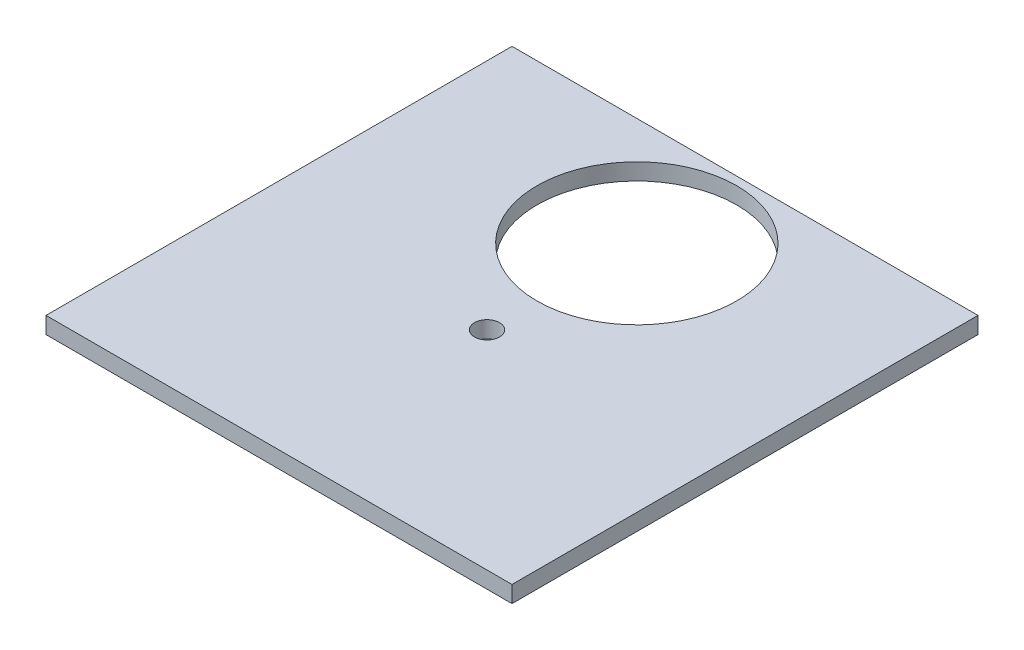
ISO-10303-21;
HEADER;
FILE_DESCRIPTION(('STEP AP214'),'2;1');
FILE_NAME('part.step','',(''),(''),'','','');
FILE_SCHEMA(('AUTOMOTIVE_DESIGN { 1 0 10303 214 1 1 1 1 }'));
ENDSEC;
DATA;
#1=APPLICATION_CONTEXT('core data for automotive mechanical design processes');
#2=APPLICATION_PROTOCOL_DEFINITION('international standard','automotive_design',2000,#1);
#3=PRODUCT_CONTEXT('',#1,'mechanical');
#4=PRODUCT('Part','Part','',(#3));
#5=PRODUCT_RELATED_PRODUCT_CATEGORY('part','',(#4));
#6=PRODUCT_DEFINITION_FORMATION('','',#4);
#7=PRODUCT_DEFINITION_CONTEXT('part definition',#1,'design');
#8=PRODUCT_DEFINITION('design','',#6,#7);
#9=PRODUCT_DEFINITION_SHAPE('','',#8);
#10=(LENGTH_UNIT() NAMED_UNIT(*) SI_UNIT(.MILLI.,.METRE.));
#11=(NAMED_UNIT(*) PLANE_ANGLE_UNIT() SI_UNIT($,.RADIAN.));
#12=(NAMED_UNIT(*) SI_UNIT($,.STERADIAN.) SOLID_ANGLE_UNIT());
#13=UNCERTAINTY_MEASURE_WITH_UNIT(LENGTH_MEASURE(1.E-05),#10,'distance_accuracy_value','');
#14=(GEOMETRIC_REPRESENTATION_CONTEXT(3) GLOBAL_UNCERTAINTY_ASSIGNED_CONTEXT((#13)) GLOBAL_UNIT_ASSIGNED_CONTEXT((#10,
#11,#12)) REPRESENTATION_CONTEXT('',''));
#15=CARTESIAN_POINT('',(0.,0.,0.));
#16=DIRECTION('',(0.,0.,1.));
#17=DIRECTION('',(1.,0.,0.));
#18=AXIS2_PLACEMENT_3D('',#15,#16,#17);
#19=CARTESIAN_POINT('',(45.7068504945369,-2.54,30.903644768989));
#20=DIRECTION('',(1.,0.,0.));
#21=DIRECTION('',(0.,0.,-1.));
#22=AXIS2_PLACEMENT_3D('',#19,#20,#21);
#23=PLANE('',#22);
#24=DIRECTION('',(0.,0.,-1.));
#25=VECTOR('',#24,1.);
#26=CARTESIAN_POINT('',(45.7068504945369,0.,30.903644768989));
#27=LINE('',#26,#25);
#28=CARTESIAN_POINT('',(45.7068504945369,0.,30.903644768989));
#29=VERTEX_POINT('',#28);
#30=CARTESIAN_POINT('',(45.7068504945369,0.,-40.2163552310109));
#31=VERTEX_POINT('',#30);
#32=EDGE_CURVE('E98',#29,#31,#27,.T.);
#33=ORIENTED_EDGE('',*,*,#32,.F.);
#34=DIRECTION('',(0.,1.,0.));
#35=VECTOR('',#34,1.);
#36=CARTESIAN_POINT('',(45.7068504945369,-2.54,30.903644768989));
#37=LINE('',#36,#35);
#38=CARTESIAN_POINT('',(45.7068504945369,-2.54,30.903644768989));
#39=VERTEX_POINT('',#38);
#40=EDGE_CURVE('E11',#39,#29,#37,.T.);
#41=ORIENTED_EDGE('',*,*,#40,.F.);
#42=DIRECTION('',(0.,0.,-1.));
#43=VECTOR('',#42,1.);
#44=CARTESIAN_POINT('',(45.7068504945369,-2.54,30.903644768989));
#45=LINE('',#44,#43);
#46=CARTESIAN_POINT('',(45.7068504945369,-2.54,-40.2163552310109));
#47=VERTEX_POINT('',#46);
#48=EDGE_CURVE('E91',#39,#47,#45,.T.);
#49=ORIENTED_EDGE('',*,*,#48,.T.);
#50=DIRECTION('',(0.,1.,0.));
#51=VECTOR('',#50,1.);
#52=CARTESIAN_POINT('',(45.7068504945369,-2.54,-40.2163552310109));
#53=LINE('',#52,#51);
#54=EDGE_CURVE('E36',#47,#31,#53,.T.);
#55=ORIENTED_EDGE('',*,*,#54,.T.);
#56=EDGE_LOOP('',(#33,#41,#49,#55));
#57=FACE_BOUND('',#56,.T.);
#58=ADVANCED_FACE('F33',(#57),#23,.T.);
#59=CARTESIAN_POINT('',(-25.4131495054631,-2.54,30.903644768989));
#60=DIRECTION('',(0.,0.,1.));
#61=DIRECTION('',(1.,0.,0.));
#62=AXIS2_PLACEMENT_3D('',#59,#60,#61);
#63=PLANE('',#62);
#64=DIRECTION('',(1.,0.,0.));
#65=VECTOR('',#64,1.);
#66=CARTESIAN_POINT('',(-25.4131495054631,0.,30.903644768989));
#67=LINE('',#66,#65);
#68=CARTESIAN_POINT('',(-25.4131495054631,0.,30.903644768989));
#69=VERTEX_POINT('',#68);
#70=EDGE_CURVE('E93',#69,#29,#67,.T.);
#71=ORIENTED_EDGE('',*,*,#70,.F.);
#72=DIRECTION('',(0.,1.,0.));
#73=VECTOR('',#72,1.);
#74=CARTESIAN_POINT('',(-25.4131495054631,-2.54,30.903644768989));
#75=LINE('',#74,#73);
#76=CARTESIAN_POINT('',(-25.4131495054631,-2.54,30.903644768989));
#77=VERTEX_POINT('',#76);
#78=EDGE_CURVE('E42',#77,#69,#75,.T.);
#79=ORIENTED_EDGE('',*,*,#78,.F.);
#80=DIRECTION('',(1.,0.,0.));
#81=VECTOR('',#80,1.);
#82=CARTESIAN_POINT('',(-25.4131495054631,-2.54,30.903644768989));
#83=LINE('',#82,#81);
#84=EDGE_CURVE('E88',#77,#39,#83,.T.);
#85=ORIENTED_EDGE('',*,*,#84,.T.);
#86=ORIENTED_EDGE('',*,*,#40,.T.);
#87=EDGE_LOOP('',(#71,#79,#85,#86));
#88=FACE_BOUND('',#87,.T.);
#89=ADVANCED_FACE('F109',(#88),#63,.T.);
#90=CARTESIAN_POINT('',(-25.4131495054631,-2.54,30.903644768989));
#91=DIRECTION('',(-1.,0.,0.));
#92=DIRECTION('',(0.,0.,1.));
#93=AXIS2_PLACEMENT_3D('',#90,#91,#92);
#94=PLANE('',#93);
#95=DIRECTION('',(0.,0.,1.));
#96=VECTOR('',#95,1.);
#97=CARTESIAN_POINT('',(-25.4131495054631,0.,30.903644768989));
#98=LINE('',#97,#96);
#99=CARTESIAN_POINT('',(-25.4131495054631,0.,-40.2163552310109));
#100=VERTEX_POINT('',#99);
#101=EDGE_CURVE('E83',#100,#69,#98,.T.);
#102=ORIENTED_EDGE('',*,*,#101,.F.);
#103=DIRECTION('',(0.,1.,0.));
#104=VECTOR('',#103,1.);
#105=CARTESIAN_POINT('',(-25.4131495054631,-2.54,-40.2163552310109));
#106=LINE('',#105,#104);
#107=CARTESIAN_POINT('',(-25.4131495054631,-2.54,-40.2163552310109));
#108=VERTEX_POINT('',#107);
#109=EDGE_CURVE('E78',#108,#100,#106,.T.);
#110=ORIENTED_EDGE('',*,*,#109,.F.);
#111=DIRECTION('',(0.,0.,1.));
#112=VECTOR('',#111,1.);
#113=CARTESIAN_POINT('',(-25.4131495054631,-2.54,30.903644768989));
#114=LINE('',#113,#112);
#115=EDGE_CURVE('E81',#108,#77,#114,.T.);
#116=ORIENTED_EDGE('',*,*,#115,.T.);
#117=ORIENTED_EDGE('',*,*,#78,.T.);
#118=EDGE_LOOP('',(#102,#110,#116,#117));
#119=FACE_BOUND('',#118,.T.);
#120=ADVANCED_FACE('F80',(#119),#94,.T.);
#121=CARTESIAN_POINT('',(-25.4131495054631,-2.54,-40.2163552310109));
#122=DIRECTION('',(0.,0.,-1.));
#123=DIRECTION('',(-1.,0.,0.));
#124=AXIS2_PLACEMENT_3D('',#121,#122,#123);
#125=PLANE('',#124);
#126=DIRECTION('',(-1.,0.,0.));
#127=VECTOR('',#126,1.);
#128=CARTESIAN_POINT('',(-25.4131495054631,0.,-40.2163552310109));
#129=LINE('',#128,#127);
#130=EDGE_CURVE('E101',#31,#100,#129,.T.);
#131=ORIENTED_EDGE('',*,*,#130,.F.);
#132=ORIENTED_EDGE('',*,*,#54,.F.);
#133=DIRECTION('',(-1.,0.,0.));
#134=VECTOR('',#133,1.);
#135=CARTESIAN_POINT('',(-25.4131495054631,-2.54,-40.2163552310109));
#136=LINE('',#135,#134);
#137=EDGE_CURVE('E87',#47,#108,#136,.T.);
#138=ORIENTED_EDGE('',*,*,#137,.T.);
#139=ORIENTED_EDGE('',*,*,#109,.T.);
#140=EDGE_LOOP('',(#131,#132,#138,#139));
#141=FACE_BOUND('',#140,.T.);
#142=ADVANCED_FACE('F90',(#141),#125,.T.);
#143=CARTESIAN_POINT('',(0.,-2.54,0.));
#144=DIRECTION('',(0.,-1.,0.));
#145=DIRECTION('',(0.,0.,-1.));
#146=AXIS2_PLACEMENT_3D('',#143,#144,#145);
#147=PLANE('',#146);
#148=CARTESIAN_POINT('',(10.1468504945369,-2.54,-0.84635523101094));
#149=DIRECTION('',(0.,-1.,0.));
#150=DIRECTION('',(0.,0.,-1.));
#151=AXIS2_PLACEMENT_3D('',#148,#149,#150);
#152=CIRCLE('',#151,1.905);
#153=CARTESIAN_POINT('',(10.1468504945369,-2.54,-2.75135523101094));
#154=VERTEX_POINT('',#153);
#155=EDGE_CURVE('E143',#154,#154,#152,.T.);
#156=ORIENTED_EDGE('',*,*,#155,.F.);
#157=EDGE_LOOP('',(#156));
#158=FACE_BOUND('',#157,.T.);
#159=CARTESIAN_POINT('',(10.1468504945369,-2.54,-23.7063552310109));
#160=DIRECTION('',(0.,-1.,0.));
#161=DIRECTION('',(0.,0.,-1.));
#162=AXIS2_PLACEMENT_3D('',#159,#160,#161);
#163=CIRCLE('',#162,15.24);
#164=CARTESIAN_POINT('',(10.1468504945369,-2.54,-38.9463552310109));
#165=VERTEX_POINT('',#164);
#166=EDGE_CURVE('E102',#165,#165,#163,.T.);
#167=ORIENTED_EDGE('',*,*,#166,.F.);
#168=EDGE_LOOP('',(#167));
#169=FACE_BOUND('',#168,.T.);
#170=ORIENTED_EDGE('',*,*,#48,.F.);
#171=ORIENTED_EDGE('',*,*,#84,.F.);
#172=ORIENTED_EDGE('',*,*,#115,.F.);
#173=ORIENTED_EDGE('',*,*,#137,.F.);
#174=EDGE_LOOP('',(#170,#171,#172,#173));
#175=FACE_BOUND('',#174,.T.);
#176=ADVANCED_FACE('F86',(#158,#169,#175),#147,.T.);
#177=CARTESIAN_POINT('',(0.,0.,0.));
#178=DIRECTION('',(0.,-1.,0.));
#179=DIRECTION('',(0.,0.,-1.));
#180=AXIS2_PLACEMENT_3D('',#177,#178,#179);
#181=PLANE('',#180);
#182=CARTESIAN_POINT('',(10.1468504945369,0.,-0.84635523101094));
#183=DIRECTION('',(0.,1.,0.));
#184=DIRECTION('',(0.,0.,1.));
#185=AXIS2_PLACEMENT_3D('',#182,#183,#184);
#186=CIRCLE('',#185,1.905);
#187=CARTESIAN_POINT('',(10.1468504945369,0.,1.05864476898906));
#188=VERTEX_POINT('',#187);
#189=EDGE_CURVE('E146',#188,#188,#186,.T.);
#190=ORIENTED_EDGE('',*,*,#189,.F.);
#191=EDGE_LOOP('',(#190));
#192=FACE_BOUND('',#191,.T.);
#193=CARTESIAN_POINT('',(10.1468504945369,0.,-23.7063552310109));
#194=DIRECTION('',(0.,1.,0.));
#195=DIRECTION('',(0.,0.,1.));
#196=AXIS2_PLACEMENT_3D('',#193,#194,#195);
#197=CIRCLE('',#196,15.24);
#198=CARTESIAN_POINT('',(10.1468504945369,0.,-8.46635523101094));
#199=VERTEX_POINT('',#198);
#200=EDGE_CURVE('E148',#199,#199,#197,.T.);
#201=ORIENTED_EDGE('',*,*,#200,.F.);
#202=EDGE_LOOP('',(#201));
#203=FACE_BOUND('',#202,.T.);
#204=ORIENTED_EDGE('',*,*,#32,.T.);
#205=ORIENTED_EDGE('',*,*,#130,.T.);
#206=ORIENTED_EDGE('',*,*,#101,.T.);
#207=ORIENTED_EDGE('',*,*,#70,.T.);
#208=EDGE_LOOP('',(#204,#205,#206,#207));
#209=FACE_BOUND('',#208,.T.);
#210=ADVANCED_FACE('F108',(#192,#203,#209),#181,.F.);
#211=CARTESIAN_POINT('',(10.1468504945369,-15.748,-23.7063552310109));
#212=DIRECTION('',(0.,1.,0.));
#213=DIRECTION('',(0.,0.,1.));
#214=AXIS2_PLACEMENT_3D('',#211,#212,#213);
#215=CYLINDRICAL_SURFACE('',#214,15.24);
#216=ORIENTED_EDGE('',*,*,#166,.T.);
#217=EDGE_LOOP('',(#216));
#218=FACE_BOUND('',#217,.T.);
#219=ORIENTED_EDGE('',*,*,#200,.T.);
#220=EDGE_LOOP('',(#219));
#221=FACE_BOUND('',#220,.T.);
#222=ADVANCED_FACE('F128',(#218,#221),#215,.F.);
#223=CARTESIAN_POINT('',(10.1468504945369,-15.748,-0.84635523101094));
#224=DIRECTION('',(0.,1.,0.));
#225=DIRECTION('',(0.,0.,1.));
#226=AXIS2_PLACEMENT_3D('',#223,#224,#225);
#227=CYLINDRICAL_SURFACE('',#226,1.905);
#228=ORIENTED_EDGE('',*,*,#155,.T.);
#229=EDGE_LOOP('',(#228));
#230=FACE_BOUND('',#229,.T.);
#231=ORIENTED_EDGE('',*,*,#189,.T.);
#232=EDGE_LOOP('',(#231));
#233=FACE_BOUND('',#232,.T.);
#234=ADVANCED_FACE('F135',(#230,#233),#227,.F.);
#235=CLOSED_SHELL('',(#58,#89,#120,#142,#176,#210,#222,#234));
#236=MANIFOLD_SOLID_BREP('B2',#235);
#237=ADVANCED_BREP_SHAPE_REPRESENTATION('',(#18,#236),#14);
#238=SHAPE_DEFINITION_REPRESENTATION(#9,#237);
ENDSEC;
END-ISO-10303-21;
